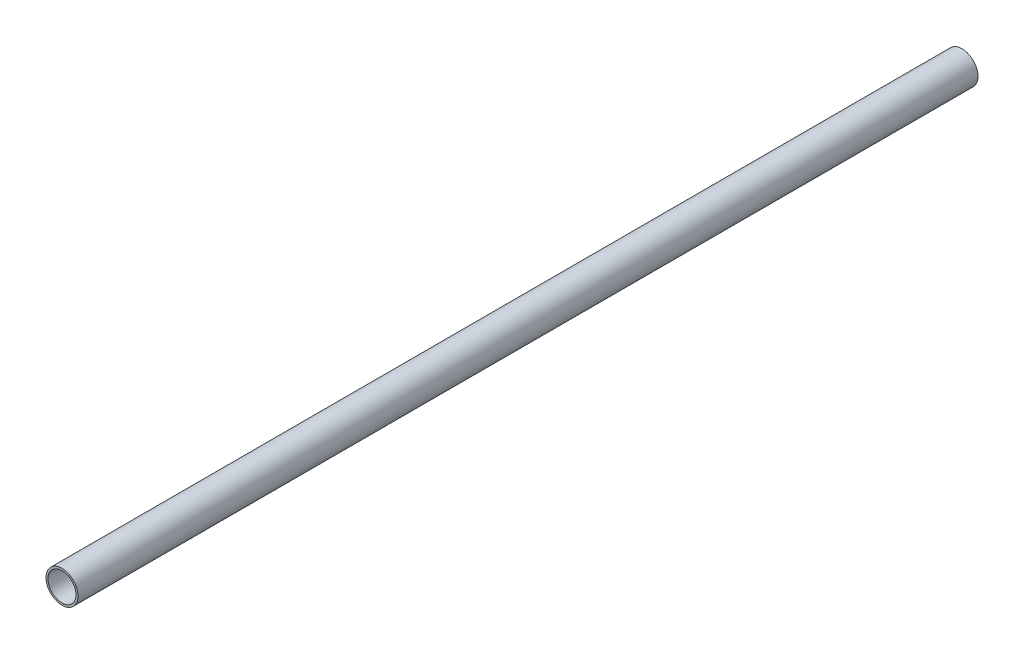
ISO-10303-21;
HEADER;
FILE_DESCRIPTION(('STEP AP214'),'2;1');
FILE_NAME('part.step','',(''),(''),'','','');
FILE_SCHEMA(('AUTOMOTIVE_DESIGN { 1 0 10303 214 1 1 1 1 }'));
ENDSEC;
DATA;
#1=APPLICATION_CONTEXT('core data for automotive mechanical design processes');
#2=APPLICATION_PROTOCOL_DEFINITION('international standard','automotive_design',2000,#1);
#3=PRODUCT_CONTEXT('',#1,'mechanical');
#4=PRODUCT('Part','Part','',(#3));
#5=PRODUCT_RELATED_PRODUCT_CATEGORY('part','',(#4));
#6=PRODUCT_DEFINITION_FORMATION('','',#4);
#7=PRODUCT_DEFINITION_CONTEXT('part definition',#1,'design');
#8=PRODUCT_DEFINITION('design','',#6,#7);
#9=PRODUCT_DEFINITION_SHAPE('','',#8);
#10=(LENGTH_UNIT() NAMED_UNIT(*) SI_UNIT(.MILLI.,.METRE.));
#11=(NAMED_UNIT(*) PLANE_ANGLE_UNIT() SI_UNIT($,.RADIAN.));
#12=(NAMED_UNIT(*) SI_UNIT($,.STERADIAN.) SOLID_ANGLE_UNIT());
#13=UNCERTAINTY_MEASURE_WITH_UNIT(LENGTH_MEASURE(1.E-05),#10,'distance_accuracy_value','');
#14=(GEOMETRIC_REPRESENTATION_CONTEXT(3) GLOBAL_UNCERTAINTY_ASSIGNED_CONTEXT((#13)) GLOBAL_UNIT_ASSIGNED_CONTEXT((#10,
#11,#12)) REPRESENTATION_CONTEXT('',''));
#15=CARTESIAN_POINT('',(0.,0.,0.));
#16=DIRECTION('',(0.,0.,1.));
#17=DIRECTION('',(1.,0.,0.));
#18=AXIS2_PLACEMENT_3D('',#15,#16,#17);
#19=CARTESIAN_POINT('',(0.,0.,-225.));
#20=DIRECTION('',(0.,0.,1.));
#21=DIRECTION('',(1.,0.,0.));
#22=AXIS2_PLACEMENT_3D('',#19,#20,#21);
#23=CYLINDRICAL_SURFACE('',#22,7.);
#24=CARTESIAN_POINT('',(0.,0.,225.));
#25=DIRECTION('',(0.,0.,1.));
#26=DIRECTION('',(1.,0.,0.));
#27=AXIS2_PLACEMENT_3D('',#24,#25,#26);
#28=CIRCLE('',#27,7.);
#29=CARTESIAN_POINT('',(7.,0.,225.));
#30=VERTEX_POINT('',#29);
#31=EDGE_CURVE('E18',#30,#30,#28,.F.);
#32=ORIENTED_EDGE('',*,*,#31,.F.);
#33=EDGE_LOOP('',(#32));
#34=FACE_BOUND('',#33,.T.);
#35=CARTESIAN_POINT('',(0.,0.,-225.));
#36=DIRECTION('',(0.,0.,1.));
#37=DIRECTION('',(1.,0.,0.));
#38=AXIS2_PLACEMENT_3D('',#35,#36,#37);
#39=CIRCLE('',#38,7.);
#40=CARTESIAN_POINT('',(7.,0.,-225.));
#41=VERTEX_POINT('',#40);
#42=EDGE_CURVE('E27',#41,#41,#39,.F.);
#43=ORIENTED_EDGE('',*,*,#42,.T.);
#44=EDGE_LOOP('',(#43));
#45=FACE_BOUND('',#44,.T.);
#46=ADVANCED_FACE('F15',(#34,#45),#23,.F.);
#47=CARTESIAN_POINT('',(0.,0.,225.));
#48=DIRECTION('',(0.,0.,1.));
#49=DIRECTION('',(1.,0.,0.));
#50=AXIS2_PLACEMENT_3D('',#47,#48,#49);
#51=PLANE('',#50);
#52=ORIENTED_EDGE('',*,*,#31,.T.);
#53=EDGE_LOOP('',(#52));
#54=FACE_BOUND('',#53,.T.);
#55=CARTESIAN_POINT('',(0.,0.,225.));
#56=DIRECTION('',(0.,0.,1.));
#57=DIRECTION('',(1.,0.,0.));
#58=AXIS2_PLACEMENT_3D('',#55,#56,#57);
#59=CIRCLE('',#58,8.);
#60=CARTESIAN_POINT('',(8.,0.,225.));
#61=VERTEX_POINT('',#60);
#62=EDGE_CURVE('E22',#61,#61,#59,.F.);
#63=ORIENTED_EDGE('',*,*,#62,.F.);
#64=EDGE_LOOP('',(#63));
#65=FACE_BOUND('',#64,.T.);
#66=ADVANCED_FACE('F35',(#54,#65),#51,.T.);
#67=CARTESIAN_POINT('',(0.,0.,-225.));
#68=DIRECTION('',(0.,0.,1.));
#69=DIRECTION('',(1.,0.,0.));
#70=AXIS2_PLACEMENT_3D('',#67,#68,#69);
#71=PLANE('',#70);
#72=ORIENTED_EDGE('',*,*,#42,.F.);
#73=EDGE_LOOP('',(#72));
#74=FACE_BOUND('',#73,.T.);
#75=CARTESIAN_POINT('',(0.,0.,-225.));
#76=DIRECTION('',(0.,0.,1.));
#77=DIRECTION('',(1.,0.,0.));
#78=AXIS2_PLACEMENT_3D('',#75,#76,#77);
#79=CIRCLE('',#78,8.);
#80=CARTESIAN_POINT('',(8.,0.,-225.));
#81=VERTEX_POINT('',#80);
#82=EDGE_CURVE('E10',#81,#81,#79,.T.);
#83=ORIENTED_EDGE('',*,*,#82,.F.);
#84=EDGE_LOOP('',(#83));
#85=FACE_BOUND('',#84,.T.);
#86=ADVANCED_FACE('F43',(#74,#85),#71,.F.);
#87=CARTESIAN_POINT('',(0.,0.,-225.));
#88=DIRECTION('',(0.,0.,1.));
#89=DIRECTION('',(1.,0.,0.));
#90=AXIS2_PLACEMENT_3D('',#87,#88,#89);
#91=CYLINDRICAL_SURFACE('',#90,8.);
#92=ORIENTED_EDGE('',*,*,#62,.T.);
#93=EDGE_LOOP('',(#92));
#94=FACE_BOUND('',#93,.T.);
#95=ORIENTED_EDGE('',*,*,#82,.T.);
#96=EDGE_LOOP('',(#95));
#97=FACE_BOUND('',#96,.T.);
#98=ADVANCED_FACE('F44',(#94,#97),#91,.T.);
#99=CLOSED_SHELL('',(#46,#66,#86,#98));
#100=MANIFOLD_SOLID_BREP('B1',#99);
#101=ADVANCED_BREP_SHAPE_REPRESENTATION('',(#18,#100),#14);
#102=SHAPE_DEFINITION_REPRESENTATION(#9,#101);
ENDSEC;
END-ISO-10303-21;
